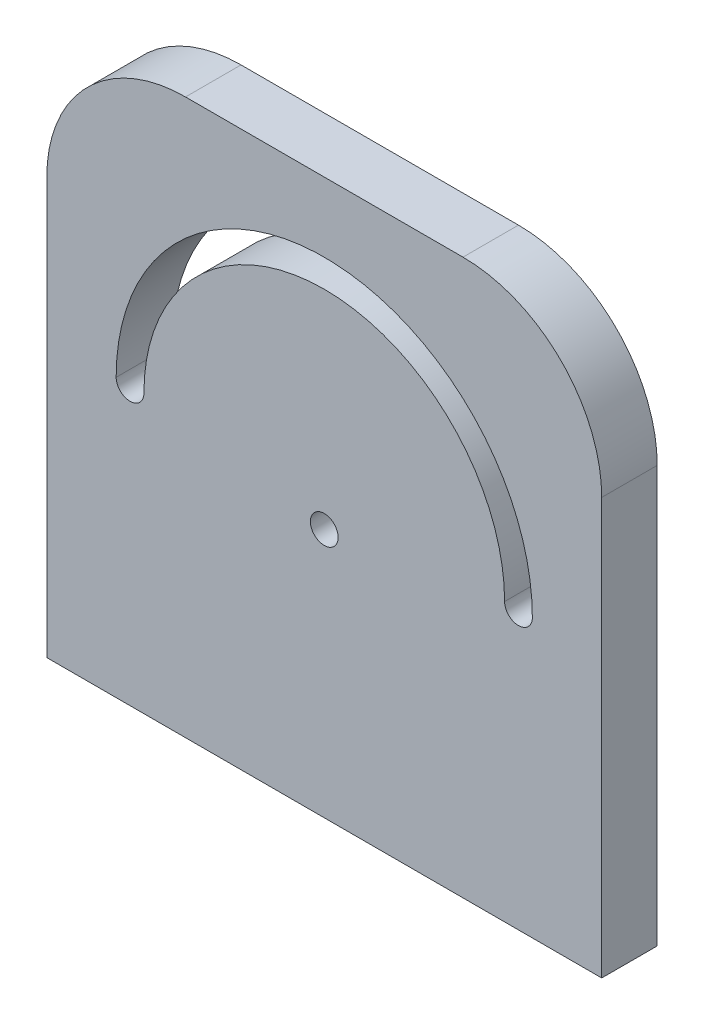
ISO-10303-21;
HEADER;
FILE_DESCRIPTION(('STEP AP214'),'2;1');
FILE_NAME('part.step','',(''),(''),'','','');
FILE_SCHEMA(('AUTOMOTIVE_DESIGN { 1 0 10303 214 1 1 1 1 }'));
ENDSEC;
DATA;
#1=APPLICATION_CONTEXT('core data for automotive mechanical design processes');
#2=APPLICATION_PROTOCOL_DEFINITION('international standard','automotive_design',2000,#1);
#3=PRODUCT_CONTEXT('',#1,'mechanical');
#4=PRODUCT('Part','Part','',(#3));
#5=PRODUCT_RELATED_PRODUCT_CATEGORY('part','',(#4));
#6=PRODUCT_DEFINITION_FORMATION('','',#4);
#7=PRODUCT_DEFINITION_CONTEXT('part definition',#1,'design');
#8=PRODUCT_DEFINITION('design','',#6,#7);
#9=PRODUCT_DEFINITION_SHAPE('','',#8);
#10=(LENGTH_UNIT() NAMED_UNIT(*) SI_UNIT(.MILLI.,.METRE.));
#11=(NAMED_UNIT(*) PLANE_ANGLE_UNIT() SI_UNIT($,.RADIAN.));
#12=(NAMED_UNIT(*) SI_UNIT($,.STERADIAN.) SOLID_ANGLE_UNIT());
#13=UNCERTAINTY_MEASURE_WITH_UNIT(LENGTH_MEASURE(1.E-05),#10,'distance_accuracy_value','');
#14=(GEOMETRIC_REPRESENTATION_CONTEXT(3) GLOBAL_UNCERTAINTY_ASSIGNED_CONTEXT((#13)) GLOBAL_UNIT_ASSIGNED_CONTEXT((#10,
#11,#12)) REPRESENTATION_CONTEXT('',''));
#15=CARTESIAN_POINT('',(0.,0.,0.));
#16=DIRECTION('',(0.,0.,1.));
#17=DIRECTION('',(1.,0.,0.));
#18=AXIS2_PLACEMENT_3D('',#15,#16,#17);
#19=CARTESIAN_POINT('',(25.,25.,10.));
#20=DIRECTION('',(0.,0.,-1.));
#21=DIRECTION('',(-1.,0.,0.));
#22=AXIS2_PLACEMENT_3D('',#19,#20,#21);
#23=CYLINDRICAL_SURFACE('',#22,25.);
#24=DIRECTION('',(0.,0.,-1.));
#25=VECTOR('',#24,1.);
#26=CARTESIAN_POINT('',(25.,50.,10.));
#27=LINE('',#26,#25);
#28=CARTESIAN_POINT('',(25.,50.,10.));
#29=VERTEX_POINT('',#28);
#30=CARTESIAN_POINT('',(25.,50.,0.));
#31=VERTEX_POINT('',#30);
#32=EDGE_CURVE('E194',#29,#31,#27,.T.);
#33=ORIENTED_EDGE('',*,*,#32,.F.);
#34=CARTESIAN_POINT('',(25.,25.,10.));
#35=DIRECTION('',(0.,0.,1.));
#36=DIRECTION('',(1.,0.,0.));
#37=AXIS2_PLACEMENT_3D('',#34,#35,#36);
#38=CIRCLE('',#37,25.);
#39=CARTESIAN_POINT('',(50.,25.,10.));
#40=VERTEX_POINT('',#39);
#41=EDGE_CURVE('E44',#40,#29,#38,.T.);
#42=ORIENTED_EDGE('',*,*,#41,.F.);
#43=DIRECTION('',(0.,0.,-1.));
#44=VECTOR('',#43,1.);
#45=CARTESIAN_POINT('',(50.,25.,10.));
#46=LINE('',#45,#44);
#47=CARTESIAN_POINT('',(50.,25.,0.));
#48=VERTEX_POINT('',#47);
#49=EDGE_CURVE('E197',#48,#40,#46,.F.);
#50=ORIENTED_EDGE('',*,*,#49,.F.);
#51=CARTESIAN_POINT('',(25.,25.,0.));
#52=DIRECTION('',(0.,0.,1.));
#53=DIRECTION('',(1.,0.,0.));
#54=AXIS2_PLACEMENT_3D('',#51,#52,#53);
#55=CIRCLE('',#54,25.);
#56=EDGE_CURVE('E11',#31,#48,#55,.F.);
#57=ORIENTED_EDGE('',*,*,#56,.F.);
#58=EDGE_LOOP('',(#33,#42,#50,#57));
#59=FACE_BOUND('',#58,.T.);
#60=ADVANCED_FACE('F37',(#59),#23,.T.);
#61=CARTESIAN_POINT('',(-25.,25.,10.));
#62=DIRECTION('',(0.,0.,-1.));
#63=DIRECTION('',(-1.,0.,0.));
#64=AXIS2_PLACEMENT_3D('',#61,#62,#63);
#65=CYLINDRICAL_SURFACE('',#64,25.);
#66=DIRECTION('',(0.,0.,-1.));
#67=VECTOR('',#66,1.);
#68=CARTESIAN_POINT('',(-50.,25.,10.));
#69=LINE('',#68,#67);
#70=CARTESIAN_POINT('',(-50.,25.,10.));
#71=VERTEX_POINT('',#70);
#72=CARTESIAN_POINT('',(-50.,25.,0.));
#73=VERTEX_POINT('',#72);
#74=EDGE_CURVE('E183',#71,#73,#69,.T.);
#75=ORIENTED_EDGE('',*,*,#74,.F.);
#76=CARTESIAN_POINT('',(-25.,25.,10.));
#77=DIRECTION('',(0.,0.,1.));
#78=DIRECTION('',(1.,0.,0.));
#79=AXIS2_PLACEMENT_3D('',#76,#77,#78);
#80=CIRCLE('',#79,25.);
#81=CARTESIAN_POINT('',(-25.,50.,10.));
#82=VERTEX_POINT('',#81);
#83=EDGE_CURVE('E189',#82,#71,#80,.T.);
#84=ORIENTED_EDGE('',*,*,#83,.F.);
#85=DIRECTION('',(0.,0.,-1.));
#86=VECTOR('',#85,1.);
#87=CARTESIAN_POINT('',(-25.,50.,10.));
#88=LINE('',#87,#86);
#89=CARTESIAN_POINT('',(-25.,50.,0.));
#90=VERTEX_POINT('',#89);
#91=EDGE_CURVE('E186',#90,#82,#88,.F.);
#92=ORIENTED_EDGE('',*,*,#91,.F.);
#93=CARTESIAN_POINT('',(-25.,25.,0.));
#94=DIRECTION('',(0.,0.,1.));
#95=DIRECTION('',(1.,0.,0.));
#96=AXIS2_PLACEMENT_3D('',#93,#94,#95);
#97=CIRCLE('',#96,25.);
#98=EDGE_CURVE('E191',#73,#90,#97,.F.);
#99=ORIENTED_EDGE('',*,*,#98,.F.);
#100=EDGE_LOOP('',(#75,#84,#92,#99));
#101=FACE_BOUND('',#100,.T.);
#102=ADVANCED_FACE('F207',(#101),#65,.T.);
#103=CARTESIAN_POINT('',(-50.,-50.,10.));
#104=DIRECTION('',(1.,0.,0.));
#105=DIRECTION('',(0.,0.,-1.));
#106=AXIS2_PLACEMENT_3D('',#103,#104,#105);
#107=PLANE('',#106);
#108=DIRECTION('',(0.,-1.,0.));
#109=VECTOR('',#108,1.);
#110=CARTESIAN_POINT('',(-50.,-50.,10.));
#111=LINE('',#110,#109);
#112=CARTESIAN_POINT('',(-50.,-50.,10.));
#113=VERTEX_POINT('',#112);
#114=EDGE_CURVE('E160',#71,#113,#111,.T.);
#115=ORIENTED_EDGE('',*,*,#114,.F.);
#116=ORIENTED_EDGE('',*,*,#74,.T.);
#117=DIRECTION('',(0.,-1.,0.));
#118=VECTOR('',#117,1.);
#119=CARTESIAN_POINT('',(-50.,-50.,0.));
#120=LINE('',#119,#118);
#121=CARTESIAN_POINT('',(-50.,-50.,0.));
#122=VERTEX_POINT('',#121);
#123=EDGE_CURVE('E157',#73,#122,#120,.T.);
#124=ORIENTED_EDGE('',*,*,#123,.T.);
#125=DIRECTION('',(0.,0.,-1.));
#126=VECTOR('',#125,1.);
#127=CARTESIAN_POINT('',(-50.,-50.,10.));
#128=LINE('',#127,#126);
#129=EDGE_CURVE('E180',#113,#122,#128,.T.);
#130=ORIENTED_EDGE('',*,*,#129,.F.);
#131=EDGE_LOOP('',(#115,#116,#124,#130));
#132=FACE_BOUND('',#131,.T.);
#133=ADVANCED_FACE('F215',(#132),#107,.F.);
#134=CARTESIAN_POINT('',(50.,-50.,10.));
#135=DIRECTION('',(0.,1.,0.));
#136=DIRECTION('',(-1.,0.,0.));
#137=AXIS2_PLACEMENT_3D('',#134,#135,#136);
#138=PLANE('',#137);
#139=CARTESIAN_POINT('',(-35.,-50.,5.));
#140=DIRECTION('',(0.,-1.,0.));
#141=DIRECTION('',(1.,0.,0.));
#142=AXIS2_PLACEMENT_3D('',#139,#140,#141);
#143=CIRCLE('',#142,2.5);
#144=CARTESIAN_POINT('',(-32.5,-50.,5.));
#145=VERTEX_POINT('',#144);
#146=EDGE_CURVE('E395',#145,#145,#143,.T.);
#147=ORIENTED_EDGE('',*,*,#146,.F.);
#148=EDGE_LOOP('',(#147));
#149=FACE_BOUND('',#148,.T.);
#150=CARTESIAN_POINT('',(0.,-50.,5.));
#151=DIRECTION('',(0.,-1.,0.));
#152=DIRECTION('',(1.,0.,0.));
#153=AXIS2_PLACEMENT_3D('',#150,#151,#152);
#154=CIRCLE('',#153,2.5);
#155=CARTESIAN_POINT('',(2.50000000000001,-50.,5.));
#156=VERTEX_POINT('',#155);
#157=EDGE_CURVE('E404',#156,#156,#154,.T.);
#158=ORIENTED_EDGE('',*,*,#157,.F.);
#159=EDGE_LOOP('',(#158));
#160=FACE_BOUND('',#159,.T.);
#161=CARTESIAN_POINT('',(35.,-50.,5.));
#162=DIRECTION('',(0.,-1.,0.));
#163=DIRECTION('',(1.,0.,0.));
#164=AXIS2_PLACEMENT_3D('',#161,#162,#163);
#165=CIRCLE('',#164,2.5);
#166=CARTESIAN_POINT('',(37.5,-50.,5.));
#167=VERTEX_POINT('',#166);
#168=EDGE_CURVE('E398',#167,#167,#165,.T.);
#169=ORIENTED_EDGE('',*,*,#168,.F.);
#170=EDGE_LOOP('',(#169));
#171=FACE_BOUND('',#170,.T.);
#172=DIRECTION('',(1.,0.,0.));
#173=VECTOR('',#172,1.);
#174=CARTESIAN_POINT('',(50.,-50.,0.));
#175=LINE('',#174,#173);
#176=CARTESIAN_POINT('',(50.,-50.,0.));
#177=VERTEX_POINT('',#176);
#178=EDGE_CURVE('E172',#122,#177,#175,.T.);
#179=ORIENTED_EDGE('',*,*,#178,.T.);
#180=DIRECTION('',(0.,0.,-1.));
#181=VECTOR('',#180,1.);
#182=CARTESIAN_POINT('',(50.,-50.,10.));
#183=LINE('',#182,#181);
#184=CARTESIAN_POINT('',(50.,-50.,10.));
#185=VERTEX_POINT('',#184);
#186=EDGE_CURVE('E170',#185,#177,#183,.T.);
#187=ORIENTED_EDGE('',*,*,#186,.F.);
#188=DIRECTION('',(1.,0.,0.));
#189=VECTOR('',#188,1.);
#190=CARTESIAN_POINT('',(50.,-50.,10.));
#191=LINE('',#190,#189);
#192=EDGE_CURVE('E162',#113,#185,#191,.T.);
#193=ORIENTED_EDGE('',*,*,#192,.F.);
#194=ORIENTED_EDGE('',*,*,#129,.T.);
#195=EDGE_LOOP('',(#179,#187,#193,#194));
#196=FACE_BOUND('',#195,.T.);
#197=ADVANCED_FACE('F214',(#149,#160,#171,#196),#138,.F.);
#198=CARTESIAN_POINT('',(50.,-50.,10.));
#199=DIRECTION('',(-1.,0.,0.));
#200=DIRECTION('',(0.,0.,1.));
#201=AXIS2_PLACEMENT_3D('',#198,#199,#200);
#202=PLANE('',#201);
#203=DIRECTION('',(0.,1.,0.));
#204=VECTOR('',#203,1.);
#205=CARTESIAN_POINT('',(50.,-50.,0.));
#206=LINE('',#205,#204);
#207=EDGE_CURVE('E174',#177,#48,#206,.T.);
#208=ORIENTED_EDGE('',*,*,#207,.T.);
#209=ORIENTED_EDGE('',*,*,#49,.T.);
#210=DIRECTION('',(0.,1.,0.));
#211=VECTOR('',#210,1.);
#212=CARTESIAN_POINT('',(50.,-50.,10.));
#213=LINE('',#212,#211);
#214=EDGE_CURVE('E165',#185,#40,#213,.T.);
#215=ORIENTED_EDGE('',*,*,#214,.F.);
#216=ORIENTED_EDGE('',*,*,#186,.T.);
#217=EDGE_LOOP('',(#208,#209,#215,#216));
#218=FACE_BOUND('',#217,.T.);
#219=ADVANCED_FACE('F220',(#218),#202,.F.);
#220=CARTESIAN_POINT('',(50.,50.,10.));
#221=DIRECTION('',(0.,-1.,0.));
#222=DIRECTION('',(1.,0.,0.));
#223=AXIS2_PLACEMENT_3D('',#220,#221,#222);
#224=PLANE('',#223);
#225=DIRECTION('',(-1.,0.,0.));
#226=VECTOR('',#225,1.);
#227=CARTESIAN_POINT('',(50.,50.,10.));
#228=LINE('',#227,#226);
#229=EDGE_CURVE('E168',#29,#82,#228,.T.);
#230=ORIENTED_EDGE('',*,*,#229,.F.);
#231=ORIENTED_EDGE('',*,*,#32,.T.);
#232=DIRECTION('',(-1.,0.,0.));
#233=VECTOR('',#232,1.);
#234=CARTESIAN_POINT('',(50.,50.,0.));
#235=LINE('',#234,#233);
#236=EDGE_CURVE('E163',#31,#90,#235,.T.);
#237=ORIENTED_EDGE('',*,*,#236,.T.);
#238=ORIENTED_EDGE('',*,*,#91,.T.);
#239=EDGE_LOOP('',(#230,#231,#237,#238));
#240=FACE_BOUND('',#239,.T.);
#241=ADVANCED_FACE('F203',(#240),#224,.F.);
#242=CARTESIAN_POINT('',(0.,0.,10.));
#243=DIRECTION('',(0.,0.,1.));
#244=DIRECTION('',(1.,0.,0.));
#245=AXIS2_PLACEMENT_3D('',#242,#243,#244);
#246=PLANE('',#245);
#247=CARTESIAN_POINT('',(-35.,0.,10.));
#248=DIRECTION('',(0.,0.,1.));
#249=DIRECTION('',(1.,0.,0.));
#250=AXIS2_PLACEMENT_3D('',#247,#248,#249);
#251=CIRCLE('',#250,2.5);
#252=CARTESIAN_POINT('',(-32.5,0.,10.));
#253=VERTEX_POINT('',#252);
#254=CARTESIAN_POINT('',(-37.5,0.,10.));
#255=VERTEX_POINT('',#254);
#256=EDGE_CURVE('E127',#253,#255,#251,.F.);
#257=ORIENTED_EDGE('',*,*,#256,.T.);
#258=CARTESIAN_POINT('',(0.,0.,10.));
#259=DIRECTION('',(0.,0.,1.));
#260=DIRECTION('',(1.,0.,0.));
#261=AXIS2_PLACEMENT_3D('',#258,#259,#260);
#262=CIRCLE('',#261,37.5);
#263=CARTESIAN_POINT('',(37.5,0.,10.));
#264=VERTEX_POINT('',#263);
#265=EDGE_CURVE('E111',#255,#264,#262,.F.);
#266=ORIENTED_EDGE('',*,*,#265,.T.);
#267=CARTESIAN_POINT('',(35.,0.,10.));
#268=DIRECTION('',(0.,0.,1.));
#269=DIRECTION('',(1.,0.,0.));
#270=AXIS2_PLACEMENT_3D('',#267,#268,#269);
#271=CIRCLE('',#270,2.5);
#272=CARTESIAN_POINT('',(32.5,0.,10.));
#273=VERTEX_POINT('',#272);
#274=EDGE_CURVE('E140',#264,#273,#271,.F.);
#275=ORIENTED_EDGE('',*,*,#274,.T.);
#276=CARTESIAN_POINT('',(0.,0.,10.));
#277=DIRECTION('',(0.,0.,1.));
#278=DIRECTION('',(1.,0.,0.));
#279=AXIS2_PLACEMENT_3D('',#276,#277,#278);
#280=CIRCLE('',#279,32.5);
#281=EDGE_CURVE('E136',#273,#253,#280,.T.);
#282=ORIENTED_EDGE('',*,*,#281,.T.);
#283=EDGE_LOOP('',(#257,#266,#275,#282));
#284=FACE_BOUND('',#283,.T.);
#285=CARTESIAN_POINT('',(0.,-4.99999999999991,10.));
#286=DIRECTION('',(0.,0.,1.));
#287=DIRECTION('',(1.,0.,0.));
#288=AXIS2_PLACEMENT_3D('',#285,#286,#287);
#289=CIRCLE('',#288,2.5);
#290=CARTESIAN_POINT('',(2.49999999999999,-4.99999999999991,10.));
#291=VERTEX_POINT('',#290);
#292=EDGE_CURVE('E122',#291,#291,#289,.F.);
#293=ORIENTED_EDGE('',*,*,#292,.T.);
#294=EDGE_LOOP('',(#293));
#295=FACE_BOUND('',#294,.T.);
#296=ORIENTED_EDGE('',*,*,#214,.T.);
#297=ORIENTED_EDGE('',*,*,#41,.T.);
#298=ORIENTED_EDGE('',*,*,#229,.T.);
#299=ORIENTED_EDGE('',*,*,#83,.T.);
#300=ORIENTED_EDGE('',*,*,#114,.T.);
#301=ORIENTED_EDGE('',*,*,#192,.T.);
#302=EDGE_LOOP('',(#296,#297,#298,#299,#300,#301));
#303=FACE_BOUND('',#302,.T.);
#304=ADVANCED_FACE('F134',(#284,#295,#303),#246,.T.);
#305=CARTESIAN_POINT('',(0.,0.,0.));
#306=DIRECTION('',(0.,0.,1.));
#307=DIRECTION('',(1.,0.,0.));
#308=AXIS2_PLACEMENT_3D('',#305,#306,#307);
#309=PLANE('',#308);
#310=CARTESIAN_POINT('',(0.,0.,0.));
#311=DIRECTION('',(0.,0.,-1.));
#312=DIRECTION('',(-1.,0.,0.));
#313=AXIS2_PLACEMENT_3D('',#310,#311,#312);
#314=CIRCLE('',#313,37.5);
#315=CARTESIAN_POINT('',(-37.5,0.,0.));
#316=VERTEX_POINT('',#315);
#317=CARTESIAN_POINT('',(37.5,0.,0.));
#318=VERTEX_POINT('',#317);
#319=EDGE_CURVE('E138',#316,#318,#314,.T.);
#320=ORIENTED_EDGE('',*,*,#319,.F.);
#321=CARTESIAN_POINT('',(-35.,0.,0.));
#322=DIRECTION('',(0.,0.,-1.));
#323=DIRECTION('',(-1.,0.,0.));
#324=AXIS2_PLACEMENT_3D('',#321,#322,#323);
#325=CIRCLE('',#324,2.5);
#326=CARTESIAN_POINT('',(-32.5,0.,0.));
#327=VERTEX_POINT('',#326);
#328=EDGE_CURVE('E130',#327,#316,#325,.T.);
#329=ORIENTED_EDGE('',*,*,#328,.F.);
#330=CARTESIAN_POINT('',(0.,0.,0.));
#331=DIRECTION('',(0.,0.,1.));
#332=DIRECTION('',(-1.,0.,0.));
#333=AXIS2_PLACEMENT_3D('',#330,#331,#332);
#334=CIRCLE('',#333,32.5);
#335=CARTESIAN_POINT('',(32.5,0.,0.));
#336=VERTEX_POINT('',#335);
#337=EDGE_CURVE('E131',#336,#327,#334,.T.);
#338=ORIENTED_EDGE('',*,*,#337,.F.);
#339=CARTESIAN_POINT('',(35.,0.,0.));
#340=DIRECTION('',(0.,0.,-1.));
#341=DIRECTION('',(-1.,0.,0.));
#342=AXIS2_PLACEMENT_3D('',#339,#340,#341);
#343=CIRCLE('',#342,2.5);
#344=EDGE_CURVE('E145',#318,#336,#343,.T.);
#345=ORIENTED_EDGE('',*,*,#344,.F.);
#346=EDGE_LOOP('',(#320,#329,#338,#345));
#347=FACE_BOUND('',#346,.T.);
#348=CARTESIAN_POINT('',(0.,-4.99999999999991,0.));
#349=DIRECTION('',(0.,0.,-1.));
#350=DIRECTION('',(-1.,0.,0.));
#351=AXIS2_PLACEMENT_3D('',#348,#349,#350);
#352=CIRCLE('',#351,2.5);
#353=CARTESIAN_POINT('',(-2.50000000000001,-4.99999999999991,0.));
#354=VERTEX_POINT('',#353);
#355=EDGE_CURVE('E154',#354,#354,#352,.T.);
#356=ORIENTED_EDGE('',*,*,#355,.F.);
#357=EDGE_LOOP('',(#356));
#358=FACE_BOUND('',#357,.T.);
#359=ORIENTED_EDGE('',*,*,#236,.F.);
#360=ORIENTED_EDGE('',*,*,#56,.T.);
#361=ORIENTED_EDGE('',*,*,#207,.F.);
#362=ORIENTED_EDGE('',*,*,#178,.F.);
#363=ORIENTED_EDGE('',*,*,#123,.F.);
#364=ORIENTED_EDGE('',*,*,#98,.T.);
#365=EDGE_LOOP('',(#359,#360,#361,#362,#363,#364));
#366=FACE_BOUND('',#365,.T.);
#367=ADVANCED_FACE('F218',(#347,#358,#366),#309,.F.);
#368=CARTESIAN_POINT('',(0.,-4.99999999999991,10.001));
#369=DIRECTION('',(0.,0.,-1.));
#370=DIRECTION('',(-1.,0.,0.));
#371=AXIS2_PLACEMENT_3D('',#368,#369,#370);
#372=CYLINDRICAL_SURFACE('',#371,2.5);
#373=ORIENTED_EDGE('',*,*,#292,.F.);
#374=EDGE_LOOP('',(#373));
#375=FACE_BOUND('',#374,.T.);
#376=ORIENTED_EDGE('',*,*,#355,.T.);
#377=EDGE_LOOP('',(#376));
#378=FACE_BOUND('',#377,.T.);
#379=ADVANCED_FACE('F343',(#375,#378),#372,.F.);
#380=CARTESIAN_POINT('',(-35.,0.,10.001));
#381=DIRECTION('',(0.,0.,-1.));
#382=DIRECTION('',(-1.,0.,0.));
#383=AXIS2_PLACEMENT_3D('',#380,#381,#382);
#384=CYLINDRICAL_SURFACE('',#383,2.5);
#385=DIRECTION('',(0.,0.,-1.));
#386=VECTOR('',#385,1.);
#387=CARTESIAN_POINT('',(-32.5,0.,10.001));
#388=LINE('',#387,#386);
#389=EDGE_CURVE('E123',#253,#327,#388,.T.);
#390=ORIENTED_EDGE('',*,*,#389,.T.);
#391=ORIENTED_EDGE('',*,*,#328,.T.);
#392=DIRECTION('',(0.,0.,-1.));
#393=VECTOR('',#392,1.);
#394=CARTESIAN_POINT('',(-37.5,0.,10.001));
#395=LINE('',#394,#393);
#396=EDGE_CURVE('E115',#255,#316,#395,.T.);
#397=ORIENTED_EDGE('',*,*,#396,.F.);
#398=ORIENTED_EDGE('',*,*,#256,.F.);
#399=EDGE_LOOP('',(#390,#391,#397,#398));
#400=FACE_BOUND('',#399,.T.);
#401=ADVANCED_FACE('F126',(#400),#384,.F.);
#402=CARTESIAN_POINT('',(0.,0.,10.001));
#403=DIRECTION('',(0.,0.,-1.));
#404=DIRECTION('',(-1.,0.,0.));
#405=AXIS2_PLACEMENT_3D('',#402,#403,#404);
#406=CYLINDRICAL_SURFACE('',#405,32.5);
#407=DIRECTION('',(0.,0.,-1.));
#408=VECTOR('',#407,1.);
#409=CARTESIAN_POINT('',(32.5,0.,10.001));
#410=LINE('',#409,#408);
#411=EDGE_CURVE('E151',#273,#336,#410,.T.);
#412=ORIENTED_EDGE('',*,*,#411,.T.);
#413=ORIENTED_EDGE('',*,*,#337,.T.);
#414=ORIENTED_EDGE('',*,*,#389,.F.);
#415=ORIENTED_EDGE('',*,*,#281,.F.);
#416=EDGE_LOOP('',(#412,#413,#414,#415));
#417=FACE_BOUND('',#416,.T.);
#418=ADVANCED_FACE('F360',(#417),#406,.T.);
#419=CARTESIAN_POINT('',(35.,0.,10.001));
#420=DIRECTION('',(0.,0.,-1.));
#421=DIRECTION('',(-1.,0.,0.));
#422=AXIS2_PLACEMENT_3D('',#419,#420,#421);
#423=CYLINDRICAL_SURFACE('',#422,2.5);
#424=DIRECTION('',(0.,0.,-1.));
#425=VECTOR('',#424,1.);
#426=CARTESIAN_POINT('',(37.5,0.,10.001));
#427=LINE('',#426,#425);
#428=EDGE_CURVE('E117',#264,#318,#427,.T.);
#429=ORIENTED_EDGE('',*,*,#428,.T.);
#430=ORIENTED_EDGE('',*,*,#344,.T.);
#431=ORIENTED_EDGE('',*,*,#411,.F.);
#432=ORIENTED_EDGE('',*,*,#274,.F.);
#433=EDGE_LOOP('',(#429,#430,#431,#432));
#434=FACE_BOUND('',#433,.T.);
#435=ADVANCED_FACE('F367',(#434),#423,.F.);
#436=CARTESIAN_POINT('',(0.,0.,10.001));
#437=DIRECTION('',(0.,0.,-1.));
#438=DIRECTION('',(-1.,0.,0.));
#439=AXIS2_PLACEMENT_3D('',#436,#437,#438);
#440=CYLINDRICAL_SURFACE('',#439,37.5);
#441=ORIENTED_EDGE('',*,*,#396,.T.);
#442=ORIENTED_EDGE('',*,*,#319,.T.);
#443=ORIENTED_EDGE('',*,*,#428,.F.);
#444=ORIENTED_EDGE('',*,*,#265,.F.);
#445=EDGE_LOOP('',(#441,#442,#443,#444));
#446=FACE_BOUND('',#445,.T.);
#447=ADVANCED_FACE('F113',(#446),#440,.F.);
#448=CARTESIAN_POINT('',(35.,-30.,5.));
#449=DIRECTION('',(0.,-1.,0.));
#450=DIRECTION('',(1.,0.,0.));
#451=AXIS2_PLACEMENT_3D('',#448,#449,#450);
#452=CYLINDRICAL_SURFACE('',#451,2.5);
#453=CARTESIAN_POINT('',(35.,-30.,5.));
#454=DIRECTION('',(0.,-1.,0.));
#455=DIRECTION('',(1.,0.,0.));
#456=AXIS2_PLACEMENT_3D('',#453,#454,#455);
#457=CIRCLE('',#456,2.5);
#458=CARTESIAN_POINT('',(37.5,-30.,5.));
#459=VERTEX_POINT('',#458);
#460=EDGE_CURVE('E401',#459,#459,#457,.T.);
#461=ORIENTED_EDGE('',*,*,#460,.F.);
#462=EDGE_LOOP('',(#461));
#463=FACE_BOUND('',#462,.T.);
#464=ORIENTED_EDGE('',*,*,#168,.T.);
#465=EDGE_LOOP('',(#464));
#466=FACE_BOUND('',#465,.T.);
#467=ADVANCED_FACE('F255',(#463,#466),#452,.F.);
#468=CARTESIAN_POINT('',(35.,-30.,5.));
#469=DIRECTION('',(0.,-1.,0.));
#470=DIRECTION('',(1.,0.,0.));
#471=AXIS2_PLACEMENT_3D('',#468,#469,#470);
#472=PLANE('',#471);
#473=ORIENTED_EDGE('',*,*,#460,.T.);
#474=EDGE_LOOP('',(#473));
#475=FACE_BOUND('',#474,.T.);
#476=ADVANCED_FACE('F260',(#475),#472,.T.);
#477=CARTESIAN_POINT('',(0.,-30.,5.));
#478=DIRECTION('',(0.,-1.,0.));
#479=DIRECTION('',(1.,0.,0.));
#480=AXIS2_PLACEMENT_3D('',#477,#478,#479);
#481=CYLINDRICAL_SURFACE('',#480,2.5);
#482=CARTESIAN_POINT('',(0.,-30.,5.));
#483=DIRECTION('',(0.,-1.,0.));
#484=DIRECTION('',(1.,0.,0.));
#485=AXIS2_PLACEMENT_3D('',#482,#483,#484);
#486=CIRCLE('',#485,2.5);
#487=CARTESIAN_POINT('',(2.5,-30.,5.));
#488=VERTEX_POINT('',#487);
#489=EDGE_CURVE('E407',#488,#488,#486,.T.);
#490=ORIENTED_EDGE('',*,*,#489,.F.);
#491=EDGE_LOOP('',(#490));
#492=FACE_BOUND('',#491,.T.);
#493=ORIENTED_EDGE('',*,*,#157,.T.);
#494=EDGE_LOOP('',(#493));
#495=FACE_BOUND('',#494,.T.);
#496=ADVANCED_FACE('F270',(#492,#495),#481,.F.);
#497=CARTESIAN_POINT('',(0.,-30.,5.));
#498=DIRECTION('',(0.,-1.,0.));
#499=DIRECTION('',(1.,0.,0.));
#500=AXIS2_PLACEMENT_3D('',#497,#498,#499);
#501=PLANE('',#500);
#502=ORIENTED_EDGE('',*,*,#489,.T.);
#503=EDGE_LOOP('',(#502));
#504=FACE_BOUND('',#503,.T.);
#505=ADVANCED_FACE('F280',(#504),#501,.T.);
#506=CARTESIAN_POINT('',(-35.,-30.,5.));
#507=DIRECTION('',(0.,-1.,0.));
#508=DIRECTION('',(1.,0.,0.));
#509=AXIS2_PLACEMENT_3D('',#506,#507,#508);
#510=CYLINDRICAL_SURFACE('',#509,2.5);
#511=CARTESIAN_POINT('',(-35.,-30.,5.));
#512=DIRECTION('',(0.,-1.,0.));
#513=DIRECTION('',(1.,0.,0.));
#514=AXIS2_PLACEMENT_3D('',#511,#512,#513);
#515=CIRCLE('',#514,2.5);
#516=CARTESIAN_POINT('',(-32.5,-30.,5.));
#517=VERTEX_POINT('',#516);
#518=EDGE_CURVE('E393',#517,#517,#515,.T.);
#519=ORIENTED_EDGE('',*,*,#518,.F.);
#520=EDGE_LOOP('',(#519));
#521=FACE_BOUND('',#520,.T.);
#522=ORIENTED_EDGE('',*,*,#146,.T.);
#523=EDGE_LOOP('',(#522));
#524=FACE_BOUND('',#523,.T.);
#525=ADVANCED_FACE('F290',(#521,#524),#510,.F.);
#526=CARTESIAN_POINT('',(-35.,-30.,5.));
#527=DIRECTION('',(0.,-1.,0.));
#528=DIRECTION('',(1.,0.,0.));
#529=AXIS2_PLACEMENT_3D('',#526,#527,#528);
#530=PLANE('',#529);
#531=ORIENTED_EDGE('',*,*,#518,.T.);
#532=EDGE_LOOP('',(#531));
#533=FACE_BOUND('',#532,.T.);
#534=ADVANCED_FACE('F300',(#533),#530,.T.);
#535=CLOSED_SHELL('',(#60,#102,#133,#197,#219,#241,#304,#367,#379,#401,#418,#435,#447,#467,#476,
#496,#505,#525,#534));
#536=MANIFOLD_SOLID_BREP('B2',#535);
#537=ADVANCED_BREP_SHAPE_REPRESENTATION('',(#18,#536),#14);
#538=SHAPE_DEFINITION_REPRESENTATION(#9,#537);
ENDSEC;
END-ISO-10303-21;
